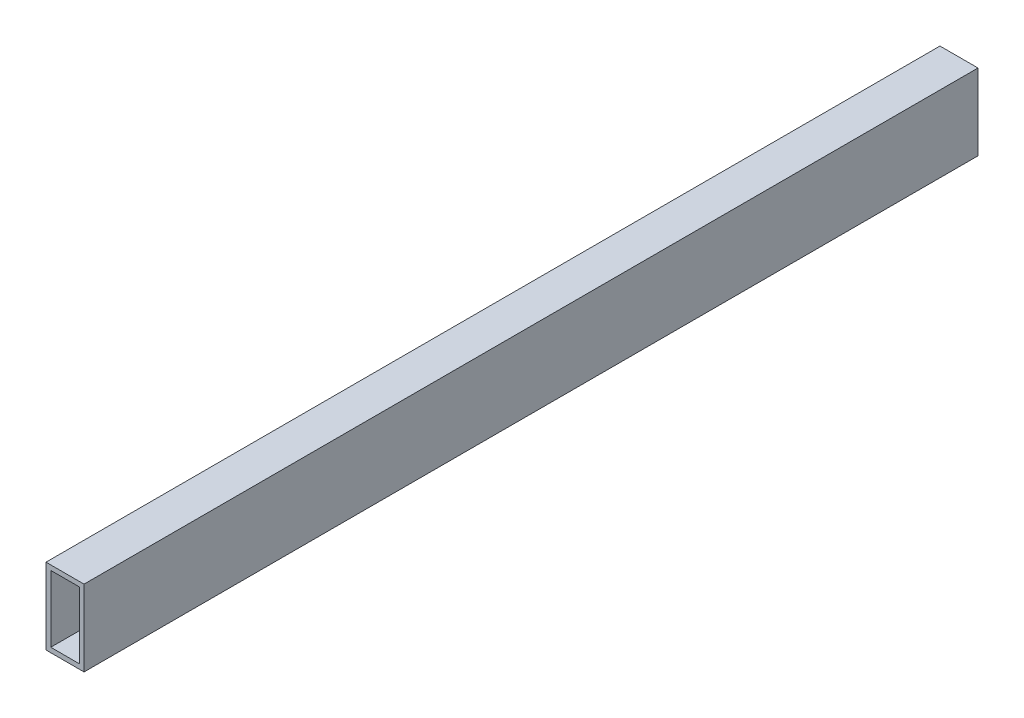
ISO-10303-21;
HEADER;
FILE_DESCRIPTION(('STEP AP214'),'2;1');
FILE_NAME('part.step','',(''),(''),'','','');
FILE_SCHEMA(('AUTOMOTIVE_DESIGN { 1 0 10303 214 1 1 1 1 }'));
ENDSEC;
DATA;
#1=APPLICATION_CONTEXT('core data for automotive mechanical design processes');
#2=APPLICATION_PROTOCOL_DEFINITION('international standard','automotive_design',2000,#1);
#3=PRODUCT_CONTEXT('',#1,'mechanical');
#4=PRODUCT('Part','Part','',(#3));
#5=PRODUCT_RELATED_PRODUCT_CATEGORY('part','',(#4));
#6=PRODUCT_DEFINITION_FORMATION('','',#4);
#7=PRODUCT_DEFINITION_CONTEXT('part definition',#1,'design');
#8=PRODUCT_DEFINITION('design','',#6,#7);
#9=PRODUCT_DEFINITION_SHAPE('','',#8);
#10=(LENGTH_UNIT() NAMED_UNIT(*) SI_UNIT(.MILLI.,.METRE.));
#11=(NAMED_UNIT(*) PLANE_ANGLE_UNIT() SI_UNIT($,.RADIAN.));
#12=(NAMED_UNIT(*) SI_UNIT($,.STERADIAN.) SOLID_ANGLE_UNIT());
#13=UNCERTAINTY_MEASURE_WITH_UNIT(LENGTH_MEASURE(1.E-05),#10,'distance_accuracy_value','');
#14=(GEOMETRIC_REPRESENTATION_CONTEXT(3) GLOBAL_UNCERTAINTY_ASSIGNED_CONTEXT((#13)) GLOBAL_UNIT_ASSIGNED_CONTEXT((#10,
#11,#12)) REPRESENTATION_CONTEXT('',''));
#15=CARTESIAN_POINT('',(0.,0.,0.));
#16=DIRECTION('',(0.,0.,1.));
#17=DIRECTION('',(1.,0.,0.));
#18=AXIS2_PLACEMENT_3D('',#15,#16,#17);
#19=CARTESIAN_POINT('',(0.,0.,596.9));
#20=DIRECTION('',(0.,0.,-1.));
#21=DIRECTION('',(-1.,0.,0.));
#22=AXIS2_PLACEMENT_3D('',#19,#20,#21);
#23=PLANE('',#22);
#24=DIRECTION('',(0.,-1.,0.));
#25=VECTOR('',#24,1.);
#26=CARTESIAN_POINT('',(0.,0.,596.9));
#27=LINE('',#26,#25);
#28=CARTESIAN_POINT('',(0.,50.8,596.9));
#29=VERTEX_POINT('',#28);
#30=CARTESIAN_POINT('',(0.,0.,596.9));
#31=VERTEX_POINT('',#30);
#32=EDGE_CURVE('E134',#29,#31,#27,.T.);
#33=ORIENTED_EDGE('',*,*,#32,.T.);
#34=DIRECTION('',(1.,0.,0.));
#35=VECTOR('',#34,1.);
#36=CARTESIAN_POINT('',(0.,0.,596.9));
#37=LINE('',#36,#35);
#38=CARTESIAN_POINT('',(25.4,0.,596.9));
#39=VERTEX_POINT('',#38);
#40=EDGE_CURVE('E137',#31,#39,#37,.T.);
#41=ORIENTED_EDGE('',*,*,#40,.T.);
#42=DIRECTION('',(0.,1.,0.));
#43=VECTOR('',#42,1.);
#44=CARTESIAN_POINT('',(25.4,0.,596.9));
#45=LINE('',#44,#43);
#46=CARTESIAN_POINT('',(25.4,50.8,596.9));
#47=VERTEX_POINT('',#46);
#48=EDGE_CURVE('E140',#39,#47,#45,.T.);
#49=ORIENTED_EDGE('',*,*,#48,.T.);
#50=DIRECTION('',(-1.,0.,0.));
#51=VECTOR('',#50,1.);
#52=CARTESIAN_POINT('',(0.,50.8,596.9));
#53=LINE('',#52,#51);
#54=EDGE_CURVE('E142',#47,#29,#53,.T.);
#55=ORIENTED_EDGE('',*,*,#54,.T.);
#56=EDGE_LOOP('',(#33,#41,#49,#55));
#57=FACE_BOUND('',#56,.T.);
#58=DIRECTION('',(0.,-1.,0.));
#59=VECTOR('',#58,1.);
#60=CARTESIAN_POINT('',(3.175,3.175,596.9));
#61=LINE('',#60,#59);
#62=CARTESIAN_POINT('',(3.175,47.625,596.9));
#63=VERTEX_POINT('',#62);
#64=CARTESIAN_POINT('',(3.175,3.175,596.9));
#65=VERTEX_POINT('',#64);
#66=EDGE_CURVE('E98',#63,#65,#61,.T.);
#67=ORIENTED_EDGE('',*,*,#66,.F.);
#68=DIRECTION('',(-1.,0.,0.));
#69=VECTOR('',#68,1.);
#70=CARTESIAN_POINT('',(3.175,47.625,596.9));
#71=LINE('',#70,#69);
#72=CARTESIAN_POINT('',(22.225,47.625,596.9));
#73=VERTEX_POINT('',#72);
#74=EDGE_CURVE('E120',#73,#63,#71,.T.);
#75=ORIENTED_EDGE('',*,*,#74,.F.);
#76=DIRECTION('',(0.,1.,0.));
#77=VECTOR('',#76,1.);
#78=CARTESIAN_POINT('',(22.225,3.175,596.9));
#79=LINE('',#78,#77);
#80=CARTESIAN_POINT('',(22.225,3.175,596.9));
#81=VERTEX_POINT('',#80);
#82=EDGE_CURVE('E118',#81,#73,#79,.T.);
#83=ORIENTED_EDGE('',*,*,#82,.F.);
#84=DIRECTION('',(1.,0.,0.));
#85=VECTOR('',#84,1.);
#86=CARTESIAN_POINT('',(3.175,3.175,596.9));
#87=LINE('',#86,#85);
#88=EDGE_CURVE('E106',#65,#81,#87,.T.);
#89=ORIENTED_EDGE('',*,*,#88,.F.);
#90=EDGE_LOOP('',(#67,#75,#83,#89));
#91=FACE_BOUND('',#90,.T.);
#92=ADVANCED_FACE('F33',(#57,#91),#23,.F.);
#93=CARTESIAN_POINT('',(0.,0.,0.));
#94=DIRECTION('',(0.,0.,-1.));
#95=DIRECTION('',(-1.,0.,0.));
#96=AXIS2_PLACEMENT_3D('',#93,#94,#95);
#97=PLANE('',#96);
#98=DIRECTION('',(0.,-1.,0.));
#99=VECTOR('',#98,1.);
#100=CARTESIAN_POINT('',(0.,0.,0.));
#101=LINE('',#100,#99);
#102=CARTESIAN_POINT('',(0.,50.8,0.));
#103=VERTEX_POINT('',#102);
#104=CARTESIAN_POINT('',(0.,0.,0.));
#105=VERTEX_POINT('',#104);
#106=EDGE_CURVE('E114',#103,#105,#101,.T.);
#107=ORIENTED_EDGE('',*,*,#106,.F.);
#108=DIRECTION('',(-1.,0.,0.));
#109=VECTOR('',#108,1.);
#110=CARTESIAN_POINT('',(0.,50.8,0.));
#111=LINE('',#110,#109);
#112=CARTESIAN_POINT('',(25.4,50.8,0.));
#113=VERTEX_POINT('',#112);
#114=EDGE_CURVE('E138',#113,#103,#111,.T.);
#115=ORIENTED_EDGE('',*,*,#114,.F.);
#116=DIRECTION('',(0.,1.,0.));
#117=VECTOR('',#116,1.);
#118=CARTESIAN_POINT('',(25.4,0.,0.));
#119=LINE('',#118,#117);
#120=CARTESIAN_POINT('',(25.4,0.,0.));
#121=VERTEX_POINT('',#120);
#122=EDGE_CURVE('E149',#121,#113,#119,.T.);
#123=ORIENTED_EDGE('',*,*,#122,.F.);
#124=DIRECTION('',(1.,0.,0.));
#125=VECTOR('',#124,1.);
#126=CARTESIAN_POINT('',(0.,0.,0.));
#127=LINE('',#126,#125);
#128=EDGE_CURVE('E147',#105,#121,#127,.T.);
#129=ORIENTED_EDGE('',*,*,#128,.F.);
#130=EDGE_LOOP('',(#107,#115,#123,#129));
#131=FACE_BOUND('',#130,.T.);
#132=DIRECTION('',(-1.,0.,0.));
#133=VECTOR('',#132,1.);
#134=CARTESIAN_POINT('',(3.175,47.625,0.));
#135=LINE('',#134,#133);
#136=CARTESIAN_POINT('',(22.225,47.625,0.));
#137=VERTEX_POINT('',#136);
#138=CARTESIAN_POINT('',(3.175,47.625,0.));
#139=VERTEX_POINT('',#138);
#140=EDGE_CURVE('E107',#137,#139,#135,.T.);
#141=ORIENTED_EDGE('',*,*,#140,.T.);
#142=DIRECTION('',(0.,-1.,0.));
#143=VECTOR('',#142,1.);
#144=CARTESIAN_POINT('',(3.175,3.175,0.));
#145=LINE('',#144,#143);
#146=CARTESIAN_POINT('',(3.175,3.175,0.));
#147=VERTEX_POINT('',#146);
#148=EDGE_CURVE('E56',#139,#147,#145,.T.);
#149=ORIENTED_EDGE('',*,*,#148,.T.);
#150=DIRECTION('',(1.,0.,0.));
#151=VECTOR('',#150,1.);
#152=CARTESIAN_POINT('',(3.175,3.175,0.));
#153=LINE('',#152,#151);
#154=CARTESIAN_POINT('',(22.225,3.175,0.));
#155=VERTEX_POINT('',#154);
#156=EDGE_CURVE('E113',#147,#155,#153,.T.);
#157=ORIENTED_EDGE('',*,*,#156,.T.);
#158=DIRECTION('',(0.,1.,0.));
#159=VECTOR('',#158,1.);
#160=CARTESIAN_POINT('',(22.225,3.175,0.));
#161=LINE('',#160,#159);
#162=EDGE_CURVE('E126',#155,#137,#161,.T.);
#163=ORIENTED_EDGE('',*,*,#162,.T.);
#164=EDGE_LOOP('',(#141,#149,#157,#163));
#165=FACE_BOUND('',#164,.T.);
#166=ADVANCED_FACE('F167',(#131,#165),#97,.T.);
#167=CARTESIAN_POINT('',(0.,0.,596.9));
#168=DIRECTION('',(1.,0.,0.));
#169=DIRECTION('',(0.,0.,-1.));
#170=AXIS2_PLACEMENT_3D('',#167,#168,#169);
#171=PLANE('',#170);
#172=ORIENTED_EDGE('',*,*,#106,.T.);
#173=DIRECTION('',(0.,0.,-1.));
#174=VECTOR('',#173,1.);
#175=CARTESIAN_POINT('',(0.,0.,596.9));
#176=LINE('',#175,#174);
#177=EDGE_CURVE('E11',#31,#105,#176,.T.);
#178=ORIENTED_EDGE('',*,*,#177,.F.);
#179=ORIENTED_EDGE('',*,*,#32,.F.);
#180=DIRECTION('',(0.,0.,-1.));
#181=VECTOR('',#180,1.);
#182=CARTESIAN_POINT('',(0.,50.8,596.9));
#183=LINE('',#182,#181);
#184=EDGE_CURVE('E144',#29,#103,#183,.T.);
#185=ORIENTED_EDGE('',*,*,#184,.T.);
#186=EDGE_LOOP('',(#172,#178,#179,#185));
#187=FACE_BOUND('',#186,.T.);
#188=ADVANCED_FACE('F35',(#187),#171,.F.);
#189=CARTESIAN_POINT('',(0.,0.,596.9));
#190=DIRECTION('',(0.,1.,0.));
#191=DIRECTION('',(0.,0.,1.));
#192=AXIS2_PLACEMENT_3D('',#189,#190,#191);
#193=PLANE('',#192);
#194=ORIENTED_EDGE('',*,*,#128,.T.);
#195=DIRECTION('',(0.,0.,-1.));
#196=VECTOR('',#195,1.);
#197=CARTESIAN_POINT('',(25.4,0.,596.9));
#198=LINE('',#197,#196);
#199=EDGE_CURVE('E41',#39,#121,#198,.T.);
#200=ORIENTED_EDGE('',*,*,#199,.F.);
#201=ORIENTED_EDGE('',*,*,#40,.F.);
#202=ORIENTED_EDGE('',*,*,#177,.T.);
#203=EDGE_LOOP('',(#194,#200,#201,#202));
#204=FACE_BOUND('',#203,.T.);
#205=ADVANCED_FACE('F177',(#204),#193,.F.);
#206=CARTESIAN_POINT('',(25.4,0.,596.9));
#207=DIRECTION('',(-1.,0.,0.));
#208=DIRECTION('',(0.,0.,1.));
#209=AXIS2_PLACEMENT_3D('',#206,#207,#208);
#210=PLANE('',#209);
#211=ORIENTED_EDGE('',*,*,#122,.T.);
#212=DIRECTION('',(0.,0.,-1.));
#213=VECTOR('',#212,1.);
#214=CARTESIAN_POINT('',(25.4,50.8,596.9));
#215=LINE('',#214,#213);
#216=EDGE_CURVE('E154',#47,#113,#215,.T.);
#217=ORIENTED_EDGE('',*,*,#216,.F.);
#218=ORIENTED_EDGE('',*,*,#48,.F.);
#219=ORIENTED_EDGE('',*,*,#199,.T.);
#220=EDGE_LOOP('',(#211,#217,#218,#219));
#221=FACE_BOUND('',#220,.T.);
#222=ADVANCED_FACE('F161',(#221),#210,.F.);
#223=CARTESIAN_POINT('',(0.,50.8,596.9));
#224=DIRECTION('',(0.,-1.,0.));
#225=DIRECTION('',(0.,0.,-1.));
#226=AXIS2_PLACEMENT_3D('',#223,#224,#225);
#227=PLANE('',#226);
#228=ORIENTED_EDGE('',*,*,#114,.T.);
#229=ORIENTED_EDGE('',*,*,#184,.F.);
#230=ORIENTED_EDGE('',*,*,#54,.F.);
#231=ORIENTED_EDGE('',*,*,#216,.T.);
#232=EDGE_LOOP('',(#228,#229,#230,#231));
#233=FACE_BOUND('',#232,.T.);
#234=ADVANCED_FACE('F171',(#233),#227,.F.);
#235=CARTESIAN_POINT('',(3.175,3.175,596.9));
#236=DIRECTION('',(1.,0.,0.));
#237=DIRECTION('',(0.,0.,-1.));
#238=AXIS2_PLACEMENT_3D('',#235,#236,#237);
#239=PLANE('',#238);
#240=ORIENTED_EDGE('',*,*,#148,.F.);
#241=DIRECTION('',(0.,0.,-1.));
#242=VECTOR('',#241,1.);
#243=CARTESIAN_POINT('',(3.175,47.625,596.9));
#244=LINE('',#243,#242);
#245=EDGE_CURVE('E102',#63,#139,#244,.T.);
#246=ORIENTED_EDGE('',*,*,#245,.F.);
#247=ORIENTED_EDGE('',*,*,#66,.T.);
#248=DIRECTION('',(0.,0.,-1.));
#249=VECTOR('',#248,1.);
#250=CARTESIAN_POINT('',(3.175,3.175,596.9));
#251=LINE('',#250,#249);
#252=EDGE_CURVE('E101',#65,#147,#251,.T.);
#253=ORIENTED_EDGE('',*,*,#252,.T.);
#254=EDGE_LOOP('',(#240,#246,#247,#253));
#255=FACE_BOUND('',#254,.T.);
#256=ADVANCED_FACE('F100',(#255),#239,.T.);
#257=CARTESIAN_POINT('',(3.175,3.175,596.9));
#258=DIRECTION('',(0.,1.,0.));
#259=DIRECTION('',(0.,0.,1.));
#260=AXIS2_PLACEMENT_3D('',#257,#258,#259);
#261=PLANE('',#260);
#262=ORIENTED_EDGE('',*,*,#156,.F.);
#263=ORIENTED_EDGE('',*,*,#252,.F.);
#264=ORIENTED_EDGE('',*,*,#88,.T.);
#265=DIRECTION('',(0.,0.,-1.));
#266=VECTOR('',#265,1.);
#267=CARTESIAN_POINT('',(22.225,3.175,596.9));
#268=LINE('',#267,#266);
#269=EDGE_CURVE('E115',#81,#155,#268,.T.);
#270=ORIENTED_EDGE('',*,*,#269,.T.);
#271=EDGE_LOOP('',(#262,#263,#264,#270));
#272=FACE_BOUND('',#271,.T.);
#273=ADVANCED_FACE('F110',(#272),#261,.T.);
#274=CARTESIAN_POINT('',(22.225,3.175,596.9));
#275=DIRECTION('',(-1.,0.,0.));
#276=DIRECTION('',(0.,0.,1.));
#277=AXIS2_PLACEMENT_3D('',#274,#275,#276);
#278=PLANE('',#277);
#279=ORIENTED_EDGE('',*,*,#162,.F.);
#280=ORIENTED_EDGE('',*,*,#269,.F.);
#281=ORIENTED_EDGE('',*,*,#82,.T.);
#282=DIRECTION('',(0.,0.,-1.));
#283=VECTOR('',#282,1.);
#284=CARTESIAN_POINT('',(22.225,47.625,596.9));
#285=LINE('',#284,#283);
#286=EDGE_CURVE('E48',#73,#137,#285,.T.);
#287=ORIENTED_EDGE('',*,*,#286,.T.);
#288=EDGE_LOOP('',(#279,#280,#281,#287));
#289=FACE_BOUND('',#288,.T.);
#290=ADVANCED_FACE('F200',(#289),#278,.T.);
#291=CARTESIAN_POINT('',(3.175,47.625,596.9));
#292=DIRECTION('',(0.,-1.,0.));
#293=DIRECTION('',(0.,0.,-1.));
#294=AXIS2_PLACEMENT_3D('',#291,#292,#293);
#295=PLANE('',#294);
#296=ORIENTED_EDGE('',*,*,#140,.F.);
#297=ORIENTED_EDGE('',*,*,#286,.F.);
#298=ORIENTED_EDGE('',*,*,#74,.T.);
#299=ORIENTED_EDGE('',*,*,#245,.T.);
#300=EDGE_LOOP('',(#296,#297,#298,#299));
#301=FACE_BOUND('',#300,.T.);
#302=ADVANCED_FACE('F204',(#301),#295,.T.);
#303=CLOSED_SHELL('',(#92,#166,#188,#205,#222,#234,#256,#273,#290,#302));
#304=MANIFOLD_SOLID_BREP('B2',#303);
#305=ADVANCED_BREP_SHAPE_REPRESENTATION('',(#18,#304),#14);
#306=SHAPE_DEFINITION_REPRESENTATION(#9,#305);
ENDSEC;
END-ISO-10303-21;
